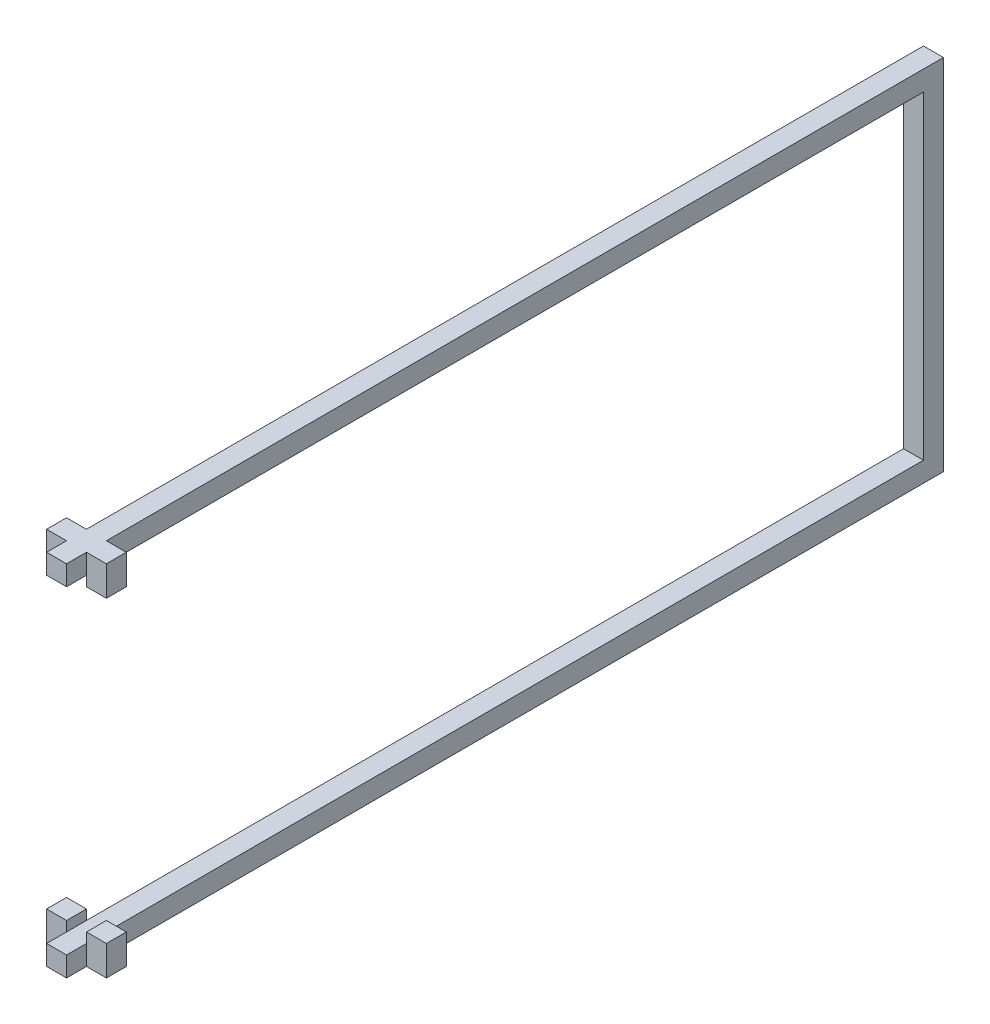
ISO-10303-21;
HEADER;
FILE_DESCRIPTION(('STEP AP214'),'2;1');
FILE_NAME('part.step','',(''),(''),'','','');
FILE_SCHEMA(('AUTOMOTIVE_DESIGN { 1 0 10303 214 1 1 1 1 }'));
ENDSEC;
DATA;
#1=APPLICATION_CONTEXT('core data for automotive mechanical design processes');
#2=APPLICATION_PROTOCOL_DEFINITION('international standard','automotive_design',2000,#1);
#3=PRODUCT_CONTEXT('',#1,'mechanical');
#4=PRODUCT('Part','Part','',(#3));
#5=PRODUCT_RELATED_PRODUCT_CATEGORY('part','',(#4));
#6=PRODUCT_DEFINITION_FORMATION('','',#4);
#7=PRODUCT_DEFINITION_CONTEXT('part definition',#1,'design');
#8=PRODUCT_DEFINITION('design','',#6,#7);
#9=PRODUCT_DEFINITION_SHAPE('','',#8);
#10=(LENGTH_UNIT() NAMED_UNIT(*) SI_UNIT(.MILLI.,.METRE.));
#11=(NAMED_UNIT(*) PLANE_ANGLE_UNIT() SI_UNIT($,.RADIAN.));
#12=(NAMED_UNIT(*) SI_UNIT($,.STERADIAN.) SOLID_ANGLE_UNIT());
#13=UNCERTAINTY_MEASURE_WITH_UNIT(LENGTH_MEASURE(1.E-05),#10,'distance_accuracy_value','');
#14=(GEOMETRIC_REPRESENTATION_CONTEXT(3) GLOBAL_UNCERTAINTY_ASSIGNED_CONTEXT((#13)) GLOBAL_UNIT_ASSIGNED_CONTEXT((#10,
#11,#12)) REPRESENTATION_CONTEXT('',''));
#15=CARTESIAN_POINT('',(0.,0.,0.));
#16=DIRECTION('',(0.,0.,1.));
#17=DIRECTION('',(1.,0.,0.));
#18=AXIS2_PLACEMENT_3D('',#15,#16,#17);
#19=CARTESIAN_POINT('',(0.,0.,111.76));
#20=DIRECTION('',(-1.,0.,0.));
#21=DIRECTION('',(0.,-1.,0.));
#22=AXIS2_PLACEMENT_3D('',#19,#20,#21);
#23=PLANE('',#22);
#24=DIRECTION('',(0.,0.,-1.));
#25=VECTOR('',#24,1.);
#26=CARTESIAN_POINT('',(0.,-43.18,115.352102448428));
#27=LINE('',#26,#25);
#28=CARTESIAN_POINT('',(0.,-43.18,111.76));
#29=VERTEX_POINT('',#28);
#30=CARTESIAN_POINT('',(0.,-43.18,109.22));
#31=VERTEX_POINT('',#30);
#32=EDGE_CURVE('E455',#29,#31,#27,.T.);
#33=ORIENTED_EDGE('',*,*,#32,.T.);
#34=DIRECTION('',(0.,1.,0.));
#35=VECTOR('',#34,1.);
#36=CARTESIAN_POINT('',(0.,-40.64,109.22));
#37=LINE('',#36,#35);
#38=CARTESIAN_POINT('',(0.,-40.64,109.22));
#39=VERTEX_POINT('',#38);
#40=EDGE_CURVE('E63',#31,#39,#37,.T.);
#41=ORIENTED_EDGE('',*,*,#40,.T.);
#42=DIRECTION('',(0.,0.,-1.));
#43=VECTOR('',#42,1.);
#44=CARTESIAN_POINT('',(0.,-40.64,115.352102448428));
#45=LINE('',#44,#43);
#46=CARTESIAN_POINT('',(0.,-40.64,111.76));
#47=VERTEX_POINT('',#46);
#48=EDGE_CURVE('E461',#47,#39,#45,.T.);
#49=ORIENTED_EDGE('',*,*,#48,.F.);
#50=DIRECTION('',(0.,-1.,0.));
#51=VECTOR('',#50,1.);
#52=CARTESIAN_POINT('',(0.,-40.64,111.76));
#53=LINE('',#52,#51);
#54=EDGE_CURVE('E456',#47,#29,#53,.T.);
#55=ORIENTED_EDGE('',*,*,#54,.T.);
#56=EDGE_LOOP('',(#33,#41,#49,#55));
#57=FACE_BOUND('',#56,.T.);
#58=ADVANCED_FACE('F39',(#57),#23,.F.);
#59=CARTESIAN_POINT('',(-2.54,0.,111.76));
#60=DIRECTION('',(1.,0.,0.));
#61=DIRECTION('',(0.,0.,-1.));
#62=AXIS2_PLACEMENT_3D('',#59,#60,#61);
#63=PLANE('',#62);
#64=DIRECTION('',(0.,1.,0.));
#65=VECTOR('',#64,1.);
#66=CARTESIAN_POINT('',(-2.54,-43.18,109.22));
#67=LINE('',#66,#65);
#68=CARTESIAN_POINT('',(-2.54,-43.18,109.22));
#69=VERTEX_POINT('',#68);
#70=CARTESIAN_POINT('',(-2.54,-40.64,109.22));
#71=VERTEX_POINT('',#70);
#72=EDGE_CURVE('E312',#69,#71,#67,.T.);
#73=ORIENTED_EDGE('',*,*,#72,.F.);
#74=DIRECTION('',(0.,0.,-1.));
#75=VECTOR('',#74,1.);
#76=CARTESIAN_POINT('',(-2.54,-43.18,115.352102448428));
#77=LINE('',#76,#75);
#78=CARTESIAN_POINT('',(-2.54,-43.18,111.76));
#79=VERTEX_POINT('',#78);
#80=EDGE_CURVE('E449',#79,#69,#77,.T.);
#81=ORIENTED_EDGE('',*,*,#80,.F.);
#82=DIRECTION('',(0.,1.,0.));
#83=VECTOR('',#82,1.);
#84=CARTESIAN_POINT('',(-2.54,-40.64,111.76));
#85=LINE('',#84,#83);
#86=CARTESIAN_POINT('',(-2.54,-40.64,111.76));
#87=VERTEX_POINT('',#86);
#88=EDGE_CURVE('E444',#79,#87,#85,.T.);
#89=ORIENTED_EDGE('',*,*,#88,.T.);
#90=DIRECTION('',(0.,0.,-1.));
#91=VECTOR('',#90,1.);
#92=CARTESIAN_POINT('',(-2.54,-40.64,115.352102448428));
#93=LINE('',#92,#91);
#94=EDGE_CURVE('E469',#87,#71,#93,.T.);
#95=ORIENTED_EDGE('',*,*,#94,.T.);
#96=EDGE_LOOP('',(#73,#81,#89,#95));
#97=FACE_BOUND('',#96,.T.);
#98=ADVANCED_FACE('F582',(#97),#63,.F.);
#99=CARTESIAN_POINT('',(0.,0.,111.76));
#100=DIRECTION('',(0.,1.,0.));
#101=DIRECTION('',(0.,0.,1.));
#102=AXIS2_PLACEMENT_3D('',#99,#100,#101);
#103=PLANE('',#102);
#104=DIRECTION('',(0.,0.,-1.));
#105=VECTOR('',#104,1.);
#106=CARTESIAN_POINT('',(0.,0.,106.68));
#107=LINE('',#106,#105);
#108=CARTESIAN_POINT('',(0.,0.,109.22));
#109=VERTEX_POINT('',#108);
#110=CARTESIAN_POINT('',(0.,0.,106.68));
#111=VERTEX_POINT('',#110);
#112=EDGE_CURVE('E335',#109,#111,#107,.T.);
#113=ORIENTED_EDGE('',*,*,#112,.F.);
#114=DIRECTION('',(0.,0.,-1.));
#115=VECTOR('',#114,1.);
#116=CARTESIAN_POINT('',(0.,0.,111.76));
#117=LINE('',#116,#115);
#118=CARTESIAN_POINT('',(0.,0.,111.76));
#119=VERTEX_POINT('',#118);
#120=EDGE_CURVE('E515',#119,#109,#117,.T.);
#121=ORIENTED_EDGE('',*,*,#120,.F.);
#122=DIRECTION('',(1.,0.,0.));
#123=VECTOR('',#122,1.);
#124=CARTESIAN_POINT('',(0.,0.,111.76));
#125=LINE('',#124,#123);
#126=CARTESIAN_POINT('',(-2.54,0.,111.76));
#127=VERTEX_POINT('',#126);
#128=EDGE_CURVE('E501',#127,#119,#125,.T.);
#129=ORIENTED_EDGE('',*,*,#128,.F.);
#130=DIRECTION('',(0.,0.,-1.));
#131=VECTOR('',#130,1.);
#132=CARTESIAN_POINT('',(-2.54,0.,111.76));
#133=LINE('',#132,#131);
#134=CARTESIAN_POINT('',(-2.54,0.,109.22));
#135=VERTEX_POINT('',#134);
#136=EDGE_CURVE('E520',#127,#135,#133,.T.);
#137=ORIENTED_EDGE('',*,*,#136,.T.);
#138=DIRECTION('',(0.,0.,1.));
#139=VECTOR('',#138,1.);
#140=CARTESIAN_POINT('',(-2.54,0.,109.22));
#141=LINE('',#140,#139);
#142=CARTESIAN_POINT('',(-2.54,0.,106.68));
#143=VERTEX_POINT('',#142);
#144=EDGE_CURVE('E362',#143,#135,#141,.T.);
#145=ORIENTED_EDGE('',*,*,#144,.F.);
#146=CARTESIAN_POINT('',(-2.54,0.,2.54));
#147=VERTEX_POINT('',#146);
#148=EDGE_CURVE('E519',#143,#147,#133,.T.);
#149=ORIENTED_EDGE('',*,*,#148,.T.);
#150=DIRECTION('',(-1.,0.,0.));
#151=VECTOR('',#150,1.);
#152=CARTESIAN_POINT('',(0.,0.,2.54));
#153=LINE('',#152,#151);
#154=CARTESIAN_POINT('',(0.,0.,2.54));
#155=VERTEX_POINT('',#154);
#156=EDGE_CURVE('E473',#155,#147,#153,.T.);
#157=ORIENTED_EDGE('',*,*,#156,.F.);
#158=EDGE_CURVE('E504',#111,#155,#117,.T.);
#159=ORIENTED_EDGE('',*,*,#158,.F.);
#160=EDGE_LOOP('',(#113,#121,#129,#137,#145,#149,#157,#159));
#161=FACE_BOUND('',#160,.T.);
#162=ADVANCED_FACE('F569',(#161),#103,.F.);
#163=DIRECTION('',(0.,-1.,0.));
#164=VECTOR('',#163,1.);
#165=CARTESIAN_POINT('',(0.,0.,109.22));
#166=LINE('',#165,#164);
#167=CARTESIAN_POINT('',(0.,2.54,109.22));
#168=VERTEX_POINT('',#167);
#169=EDGE_CURVE('E388',#168,#109,#166,.T.);
#170=ORIENTED_EDGE('',*,*,#169,.F.);
#171=DIRECTION('',(0.,0.,-1.));
#172=VECTOR('',#171,1.);
#173=CARTESIAN_POINT('',(0.,2.54,111.76));
#174=LINE('',#173,#172);
#175=CARTESIAN_POINT('',(0.,2.54,111.76));
#176=VERTEX_POINT('',#175);
#177=EDGE_CURVE('E11',#176,#168,#174,.T.);
#178=ORIENTED_EDGE('',*,*,#177,.F.);
#179=DIRECTION('',(0.,1.,0.));
#180=VECTOR('',#179,1.);
#181=CARTESIAN_POINT('',(0.,0.,111.76));
#182=LINE('',#181,#180);
#183=EDGE_CURVE('E490',#119,#176,#182,.T.);
#184=ORIENTED_EDGE('',*,*,#183,.F.);
#185=ORIENTED_EDGE('',*,*,#120,.T.);
#186=EDGE_LOOP('',(#170,#178,#184,#185));
#187=FACE_BOUND('',#186,.T.);
#188=ADVANCED_FACE('F41',(#187),#23,.F.);
#189=CARTESIAN_POINT('',(0.,-40.64,106.68));
#190=VERTEX_POINT('',#189);
#191=CARTESIAN_POINT('',(0.,-40.64,2.54));
#192=VERTEX_POINT('',#191);
#193=EDGE_CURVE('E443',#190,#192,#45,.T.);
#194=ORIENTED_EDGE('',*,*,#193,.F.);
#195=DIRECTION('',(0.,-1.,0.));
#196=VECTOR('',#195,1.);
#197=CARTESIAN_POINT('',(0.,-40.64,106.68));
#198=LINE('',#197,#196);
#199=CARTESIAN_POINT('',(0.,-43.18,106.68));
#200=VERTEX_POINT('',#199);
#201=EDGE_CURVE('E291',#190,#200,#198,.T.);
#202=ORIENTED_EDGE('',*,*,#201,.T.);
#203=CARTESIAN_POINT('',(0.,-43.18,0.));
#204=VERTEX_POINT('',#203);
#205=EDGE_CURVE('E460',#200,#204,#27,.T.);
#206=ORIENTED_EDGE('',*,*,#205,.T.);
#207=DIRECTION('',(0.,1.,0.));
#208=VECTOR('',#207,1.);
#209=CARTESIAN_POINT('',(0.,0.,0.));
#210=LINE('',#209,#208);
#211=CARTESIAN_POINT('',(0.,2.54,0.));
#212=VERTEX_POINT('',#211);
#213=EDGE_CURVE('E489',#204,#212,#210,.T.);
#214=ORIENTED_EDGE('',*,*,#213,.T.);
#215=CARTESIAN_POINT('',(0.,2.54,106.68));
#216=VERTEX_POINT('',#215);
#217=EDGE_CURVE('E48',#216,#212,#174,.T.);
#218=ORIENTED_EDGE('',*,*,#217,.F.);
#219=DIRECTION('',(0.,1.,0.));
#220=VECTOR('',#219,1.);
#221=CARTESIAN_POINT('',(0.,0.,106.68));
#222=LINE('',#221,#220);
#223=EDGE_CURVE('E393',#111,#216,#222,.T.);
#224=ORIENTED_EDGE('',*,*,#223,.F.);
#225=ORIENTED_EDGE('',*,*,#158,.T.);
#226=DIRECTION('',(0.,1.,0.));
#227=VECTOR('',#226,1.);
#228=CARTESIAN_POINT('',(0.,-40.64,2.54));
#229=LINE('',#228,#227);
#230=EDGE_CURVE('E485',#192,#155,#229,.T.);
#231=ORIENTED_EDGE('',*,*,#230,.F.);
#232=EDGE_LOOP('',(#194,#202,#206,#214,#218,#224,#225,#231));
#233=FACE_BOUND('',#232,.T.);
#234=ADVANCED_FACE('F562',(#233),#23,.F.);
#235=CARTESIAN_POINT('',(-2.54,-43.18,106.68));
#236=VERTEX_POINT('',#235);
#237=CARTESIAN_POINT('',(-2.54,-43.18,0.));
#238=VERTEX_POINT('',#237);
#239=EDGE_CURVE('E454',#236,#238,#77,.T.);
#240=ORIENTED_EDGE('',*,*,#239,.F.);
#241=DIRECTION('',(0.,1.,0.));
#242=VECTOR('',#241,1.);
#243=CARTESIAN_POINT('',(-2.54,-43.18,106.68));
#244=LINE('',#243,#242);
#245=CARTESIAN_POINT('',(-2.54,-40.64,106.68));
#246=VERTEX_POINT('',#245);
#247=EDGE_CURVE('E317',#236,#246,#244,.T.);
#248=ORIENTED_EDGE('',*,*,#247,.T.);
#249=CARTESIAN_POINT('',(-2.54,-40.64,2.54));
#250=VERTEX_POINT('',#249);
#251=EDGE_CURVE('E448',#246,#250,#93,.T.);
#252=ORIENTED_EDGE('',*,*,#251,.T.);
#253=DIRECTION('',(0.,1.,0.));
#254=VECTOR('',#253,1.);
#255=CARTESIAN_POINT('',(-2.54,-40.64,2.54));
#256=LINE('',#255,#254);
#257=EDGE_CURVE('E478',#250,#147,#256,.T.);
#258=ORIENTED_EDGE('',*,*,#257,.T.);
#259=ORIENTED_EDGE('',*,*,#148,.F.);
#260=DIRECTION('',(0.,-1.,0.));
#261=VECTOR('',#260,1.);
#262=CARTESIAN_POINT('',(-2.54,2.54,106.68));
#263=LINE('',#262,#261);
#264=CARTESIAN_POINT('',(-2.54,2.54,106.68));
#265=VERTEX_POINT('',#264);
#266=EDGE_CURVE('E413',#265,#143,#263,.T.);
#267=ORIENTED_EDGE('',*,*,#266,.F.);
#268=DIRECTION('',(0.,0.,-1.));
#269=VECTOR('',#268,1.);
#270=CARTESIAN_POINT('',(-2.54,2.54,111.76));
#271=LINE('',#270,#269);
#272=CARTESIAN_POINT('',(-2.54,2.54,0.));
#273=VERTEX_POINT('',#272);
#274=EDGE_CURVE('E523',#265,#273,#271,.T.);
#275=ORIENTED_EDGE('',*,*,#274,.T.);
#276=DIRECTION('',(0.,-1.,0.));
#277=VECTOR('',#276,1.);
#278=CARTESIAN_POINT('',(-2.54,0.,0.));
#279=LINE('',#278,#277);
#280=EDGE_CURVE('E495',#273,#238,#279,.T.);
#281=ORIENTED_EDGE('',*,*,#280,.T.);
#282=EDGE_LOOP('',(#240,#248,#252,#258,#259,#267,#275,#281));
#283=FACE_BOUND('',#282,.T.);
#284=ADVANCED_FACE('F536',(#283),#63,.F.);
#285=CARTESIAN_POINT('',(0.,2.54,111.76));
#286=DIRECTION('',(0.,-1.,0.));
#287=DIRECTION('',(1.,0.,0.));
#288=AXIS2_PLACEMENT_3D('',#285,#286,#287);
#289=PLANE('',#288);
#290=DIRECTION('',(-1.,0.,0.));
#291=VECTOR('',#290,1.);
#292=CARTESIAN_POINT('',(0.,2.54,0.));
#293=LINE('',#292,#291);
#294=EDGE_CURVE('E508',#212,#273,#293,.T.);
#295=ORIENTED_EDGE('',*,*,#294,.T.);
#296=ORIENTED_EDGE('',*,*,#274,.F.);
#297=DIRECTION('',(1.,0.,0.));
#298=VECTOR('',#297,1.);
#299=CARTESIAN_POINT('',(-5.08,2.54,106.68));
#300=LINE('',#299,#298);
#301=CARTESIAN_POINT('',(-5.08,2.54,106.68));
#302=VERTEX_POINT('',#301);
#303=EDGE_CURVE('E424',#302,#265,#300,.T.);
#304=ORIENTED_EDGE('',*,*,#303,.F.);
#305=DIRECTION('',(0.,0.,-1.));
#306=VECTOR('',#305,1.);
#307=CARTESIAN_POINT('',(-5.08,2.54,109.22));
#308=LINE('',#307,#306);
#309=CARTESIAN_POINT('',(-5.08,2.54,109.22));
#310=VERTEX_POINT('',#309);
#311=EDGE_CURVE('E417',#310,#302,#308,.T.);
#312=ORIENTED_EDGE('',*,*,#311,.F.);
#313=DIRECTION('',(1.,0.,0.));
#314=VECTOR('',#313,1.);
#315=CARTESIAN_POINT('',(-5.08,2.54,109.22));
#316=LINE('',#315,#314);
#317=CARTESIAN_POINT('',(-2.54,2.54,109.22));
#318=VERTEX_POINT('',#317);
#319=EDGE_CURVE('E430',#310,#318,#316,.T.);
#320=ORIENTED_EDGE('',*,*,#319,.T.);
#321=CARTESIAN_POINT('',(-2.54,2.54,111.76));
#322=VERTEX_POINT('',#321);
#323=EDGE_CURVE('E524',#322,#318,#271,.T.);
#324=ORIENTED_EDGE('',*,*,#323,.F.);
#325=DIRECTION('',(-1.,0.,0.));
#326=VECTOR('',#325,1.);
#327=CARTESIAN_POINT('',(0.,2.54,111.76));
#328=LINE('',#327,#326);
#329=EDGE_CURVE('E494',#176,#322,#328,.T.);
#330=ORIENTED_EDGE('',*,*,#329,.F.);
#331=ORIENTED_EDGE('',*,*,#177,.T.);
#332=DIRECTION('',(-1.,0.,0.));
#333=VECTOR('',#332,1.);
#334=CARTESIAN_POINT('',(2.54,2.54,109.22));
#335=LINE('',#334,#333);
#336=CARTESIAN_POINT('',(2.54,2.54,109.22));
#337=VERTEX_POINT('',#336);
#338=EDGE_CURVE('E399',#337,#168,#335,.T.);
#339=ORIENTED_EDGE('',*,*,#338,.F.);
#340=DIRECTION('',(0.,0.,1.));
#341=VECTOR('',#340,1.);
#342=CARTESIAN_POINT('',(2.54,2.54,109.22));
#343=LINE('',#342,#341);
#344=CARTESIAN_POINT('',(2.54,2.54,106.68));
#345=VERTEX_POINT('',#344);
#346=EDGE_CURVE('E396',#345,#337,#343,.T.);
#347=ORIENTED_EDGE('',*,*,#346,.F.);
#348=DIRECTION('',(-1.,0.,0.));
#349=VECTOR('',#348,1.);
#350=CARTESIAN_POINT('',(2.54,2.54,106.68));
#351=LINE('',#350,#349);
#352=EDGE_CURVE('E409',#345,#216,#351,.T.);
#353=ORIENTED_EDGE('',*,*,#352,.T.);
#354=ORIENTED_EDGE('',*,*,#217,.T.);
#355=EDGE_LOOP('',(#295,#296,#304,#312,#320,#324,#330,#331,#339,#347,#353,#354));
#356=FACE_BOUND('',#355,.T.);
#357=ADVANCED_FACE('F542',(#356),#289,.F.);
#358=ORIENTED_EDGE('',*,*,#323,.T.);
#359=DIRECTION('',(0.,-1.,0.));
#360=VECTOR('',#359,1.);
#361=CARTESIAN_POINT('',(-2.54,2.54,109.22));
#362=LINE('',#361,#360);
#363=EDGE_CURVE('E418',#318,#135,#362,.T.);
#364=ORIENTED_EDGE('',*,*,#363,.T.);
#365=ORIENTED_EDGE('',*,*,#136,.F.);
#366=DIRECTION('',(0.,-1.,0.));
#367=VECTOR('',#366,1.);
#368=CARTESIAN_POINT('',(-2.54,0.,111.76));
#369=LINE('',#368,#367);
#370=EDGE_CURVE('E498',#322,#127,#369,.T.);
#371=ORIENTED_EDGE('',*,*,#370,.F.);
#372=EDGE_LOOP('',(#358,#364,#365,#371));
#373=FACE_BOUND('',#372,.T.);
#374=ADVANCED_FACE('F631',(#373),#63,.F.);
#375=CARTESIAN_POINT('',(0.,0.,111.76));
#376=DIRECTION('',(0.,0.,1.));
#377=DIRECTION('',(1.,0.,0.));
#378=AXIS2_PLACEMENT_3D('',#375,#376,#377);
#379=PLANE('',#378);
#380=ORIENTED_EDGE('',*,*,#183,.T.);
#381=ORIENTED_EDGE('',*,*,#329,.T.);
#382=ORIENTED_EDGE('',*,*,#370,.T.);
#383=ORIENTED_EDGE('',*,*,#128,.T.);
#384=EDGE_LOOP('',(#380,#381,#382,#383));
#385=FACE_BOUND('',#384,.T.);
#386=ADVANCED_FACE('F644',(#385),#379,.T.);
#387=CARTESIAN_POINT('',(0.,0.,0.));
#388=DIRECTION('',(0.,0.,1.));
#389=DIRECTION('',(1.,0.,0.));
#390=AXIS2_PLACEMENT_3D('',#387,#388,#389);
#391=PLANE('',#390);
#392=ORIENTED_EDGE('',*,*,#213,.F.);
#393=DIRECTION('',(-1.,0.,0.));
#394=VECTOR('',#393,1.);
#395=CARTESIAN_POINT('',(-2.54,-43.18,0.));
#396=LINE('',#395,#394);
#397=EDGE_CURVE('E433',#204,#238,#396,.T.);
#398=ORIENTED_EDGE('',*,*,#397,.T.);
#399=ORIENTED_EDGE('',*,*,#280,.F.);
#400=ORIENTED_EDGE('',*,*,#294,.F.);
#401=EDGE_LOOP('',(#392,#398,#399,#400));
#402=FACE_BOUND('',#401,.T.);
#403=ADVANCED_FACE('F545',(#402),#391,.F.);
#404=CARTESIAN_POINT('',(0.,-40.64,2.54));
#405=DIRECTION('',(0.,0.,-1.));
#406=DIRECTION('',(-1.,0.,0.));
#407=AXIS2_PLACEMENT_3D('',#404,#405,#406);
#408=PLANE('',#407);
#409=ORIENTED_EDGE('',*,*,#156,.T.);
#410=ORIENTED_EDGE('',*,*,#257,.F.);
#411=DIRECTION('',(-1.,0.,0.));
#412=VECTOR('',#411,1.);
#413=CARTESIAN_POINT('',(0.,-40.64,2.54));
#414=LINE('',#413,#412);
#415=EDGE_CURVE('E474',#192,#250,#414,.T.);
#416=ORIENTED_EDGE('',*,*,#415,.F.);
#417=ORIENTED_EDGE('',*,*,#230,.T.);
#418=EDGE_LOOP('',(#409,#410,#416,#417));
#419=FACE_BOUND('',#418,.T.);
#420=ADVANCED_FACE('F561',(#419),#408,.F.);
#421=CARTESIAN_POINT('',(0.,0.,111.76));
#422=DIRECTION('',(0.,0.,1.));
#423=DIRECTION('',(1.,0.,0.));
#424=AXIS2_PLACEMENT_3D('',#421,#422,#423);
#425=PLANE('',#424);
#426=ORIENTED_EDGE('',*,*,#88,.F.);
#427=DIRECTION('',(-1.,0.,0.));
#428=VECTOR('',#427,1.);
#429=CARTESIAN_POINT('',(-2.54,-43.18,111.76));
#430=LINE('',#429,#428);
#431=EDGE_CURVE('E450',#29,#79,#430,.T.);
#432=ORIENTED_EDGE('',*,*,#431,.F.);
#433=ORIENTED_EDGE('',*,*,#54,.F.);
#434=DIRECTION('',(1.,0.,0.));
#435=VECTOR('',#434,1.);
#436=CARTESIAN_POINT('',(-2.54,-40.64,111.76));
#437=LINE('',#436,#435);
#438=EDGE_CURVE('E439',#87,#47,#437,.T.);
#439=ORIENTED_EDGE('',*,*,#438,.F.);
#440=EDGE_LOOP('',(#426,#432,#433,#439));
#441=FACE_BOUND('',#440,.T.);
#442=ADVANCED_FACE('F584',(#441),#425,.T.);
#443=CARTESIAN_POINT('',(-2.54,-40.64,115.352102448428));
#444=DIRECTION('',(0.,1.,0.));
#445=DIRECTION('',(0.,0.,1.));
#446=AXIS2_PLACEMENT_3D('',#443,#444,#445);
#447=PLANE('',#446);
#448=DIRECTION('',(0.,0.,-1.));
#449=VECTOR('',#448,1.);
#450=CARTESIAN_POINT('',(0.,-40.64,106.68));
#451=LINE('',#450,#449);
#452=EDGE_CURVE('E55',#39,#190,#451,.T.);
#453=ORIENTED_EDGE('',*,*,#452,.T.);
#454=ORIENTED_EDGE('',*,*,#193,.T.);
#455=ORIENTED_EDGE('',*,*,#415,.T.);
#456=ORIENTED_EDGE('',*,*,#251,.F.);
#457=DIRECTION('',(0.,0.,1.));
#458=VECTOR('',#457,1.);
#459=CARTESIAN_POINT('',(-2.54,-40.64,109.22));
#460=LINE('',#459,#458);
#461=EDGE_CURVE('E235',#246,#71,#460,.T.);
#462=ORIENTED_EDGE('',*,*,#461,.T.);
#463=ORIENTED_EDGE('',*,*,#94,.F.);
#464=ORIENTED_EDGE('',*,*,#438,.T.);
#465=ORIENTED_EDGE('',*,*,#48,.T.);
#466=EDGE_LOOP('',(#453,#454,#455,#456,#462,#463,#464,#465));
#467=FACE_BOUND('',#466,.T.);
#468=ADVANCED_FACE('F554',(#467),#447,.T.);
#469=CARTESIAN_POINT('',(-2.54,-43.18,115.352102448428));
#470=DIRECTION('',(0.,-1.,0.));
#471=DIRECTION('',(0.,0.,-1.));
#472=AXIS2_PLACEMENT_3D('',#469,#470,#471);
#473=PLANE('',#472);
#474=ORIENTED_EDGE('',*,*,#32,.F.);
#475=ORIENTED_EDGE('',*,*,#431,.T.);
#476=ORIENTED_EDGE('',*,*,#80,.T.);
#477=DIRECTION('',(1.,0.,0.));
#478=VECTOR('',#477,1.);
#479=CARTESIAN_POINT('',(-5.08,-43.18,109.22));
#480=LINE('',#479,#478);
#481=CARTESIAN_POINT('',(-5.08,-43.18,109.22));
#482=VERTEX_POINT('',#481);
#483=EDGE_CURVE('E324',#482,#69,#480,.T.);
#484=ORIENTED_EDGE('',*,*,#483,.F.);
#485=DIRECTION('',(0.,0.,-1.));
#486=VECTOR('',#485,1.);
#487=CARTESIAN_POINT('',(-5.08,-43.18,109.22));
#488=LINE('',#487,#486);
#489=CARTESIAN_POINT('',(-5.08,-43.18,106.68));
#490=VERTEX_POINT('',#489);
#491=EDGE_CURVE('E316',#482,#490,#488,.T.);
#492=ORIENTED_EDGE('',*,*,#491,.T.);
#493=DIRECTION('',(1.,0.,0.));
#494=VECTOR('',#493,1.);
#495=CARTESIAN_POINT('',(-5.08,-43.18,106.68));
#496=LINE('',#495,#494);
#497=EDGE_CURVE('E331',#490,#236,#496,.T.);
#498=ORIENTED_EDGE('',*,*,#497,.T.);
#499=ORIENTED_EDGE('',*,*,#239,.T.);
#500=ORIENTED_EDGE('',*,*,#397,.F.);
#501=ORIENTED_EDGE('',*,*,#205,.F.);
#502=DIRECTION('',(-1.,0.,0.));
#503=VECTOR('',#502,1.);
#504=CARTESIAN_POINT('',(2.54,-43.18,106.68));
#505=LINE('',#504,#503);
#506=CARTESIAN_POINT('',(2.54,-43.18,106.68));
#507=VERTEX_POINT('',#506);
#508=EDGE_CURVE('E299',#507,#200,#505,.T.);
#509=ORIENTED_EDGE('',*,*,#508,.F.);
#510=DIRECTION('',(0.,0.,1.));
#511=VECTOR('',#510,1.);
#512=CARTESIAN_POINT('',(2.54,-43.18,109.22));
#513=LINE('',#512,#511);
#514=CARTESIAN_POINT('',(2.54,-43.18,109.22));
#515=VERTEX_POINT('',#514);
#516=EDGE_CURVE('E290',#507,#515,#513,.T.);
#517=ORIENTED_EDGE('',*,*,#516,.T.);
#518=DIRECTION('',(-1.,0.,0.));
#519=VECTOR('',#518,1.);
#520=CARTESIAN_POINT('',(2.54,-43.18,109.22));
#521=LINE('',#520,#519);
#522=EDGE_CURVE('E308',#515,#31,#521,.T.);
#523=ORIENTED_EDGE('',*,*,#522,.T.);
#524=EDGE_LOOP('',(#474,#475,#476,#484,#492,#498,#499,#500,#501,#509,#517,#523));
#525=FACE_BOUND('',#524,.T.);
#526=ADVANCED_FACE('F549',(#525),#473,.T.);
#527=CARTESIAN_POINT('',(-5.08,2.54,109.22));
#528=DIRECTION('',(0.,0.,1.));
#529=DIRECTION('',(1.,0.,0.));
#530=AXIS2_PLACEMENT_3D('',#527,#528,#529);
#531=PLANE('',#530);
#532=ORIENTED_EDGE('',*,*,#363,.F.);
#533=ORIENTED_EDGE('',*,*,#319,.F.);
#534=DIRECTION('',(0.,-1.,0.));
#535=VECTOR('',#534,1.);
#536=CARTESIAN_POINT('',(-5.08,2.54,109.22));
#537=LINE('',#536,#535);
#538=CARTESIAN_POINT('',(-5.08,-1.27,109.22));
#539=VERTEX_POINT('',#538);
#540=EDGE_CURVE('E421',#310,#539,#537,.T.);
#541=ORIENTED_EDGE('',*,*,#540,.T.);
#542=DIRECTION('',(-1.,0.,0.));
#543=VECTOR('',#542,1.);
#544=CARTESIAN_POINT('',(-5.08,-1.27,109.22));
#545=LINE('',#544,#543);
#546=CARTESIAN_POINT('',(-2.54,-1.27,109.22));
#547=VERTEX_POINT('',#546);
#548=EDGE_CURVE('E373',#547,#539,#545,.T.);
#549=ORIENTED_EDGE('',*,*,#548,.F.);
#550=DIRECTION('',(0.,1.,0.));
#551=VECTOR('',#550,1.);
#552=CARTESIAN_POINT('',(-2.54,-1.27,109.22));
#553=LINE('',#552,#551);
#554=EDGE_CURVE('E377',#547,#135,#553,.T.);
#555=ORIENTED_EDGE('',*,*,#554,.T.);
#556=EDGE_LOOP('',(#532,#533,#541,#549,#555));
#557=FACE_BOUND('',#556,.T.);
#558=ADVANCED_FACE('F671',(#557),#531,.T.);
#559=CARTESIAN_POINT('',(-5.08,2.54,106.68));
#560=DIRECTION('',(0.,0.,1.));
#561=DIRECTION('',(1.,0.,0.));
#562=AXIS2_PLACEMENT_3D('',#559,#560,#561);
#563=PLANE('',#562);
#564=ORIENTED_EDGE('',*,*,#266,.T.);
#565=DIRECTION('',(0.,1.,0.));
#566=VECTOR('',#565,1.);
#567=CARTESIAN_POINT('',(-2.54,-1.27,106.68));
#568=LINE('',#567,#566);
#569=CARTESIAN_POINT('',(-2.54,-1.27,106.68));
#570=VERTEX_POINT('',#569);
#571=EDGE_CURVE('E384',#570,#143,#568,.T.);
#572=ORIENTED_EDGE('',*,*,#571,.F.);
#573=DIRECTION('',(1.,0.,0.));
#574=VECTOR('',#573,1.);
#575=CARTESIAN_POINT('',(-5.08,-1.27,106.68));
#576=LINE('',#575,#574);
#577=CARTESIAN_POINT('',(-5.08,-1.27,106.68));
#578=VERTEX_POINT('',#577);
#579=EDGE_CURVE('E367',#578,#570,#576,.T.);
#580=ORIENTED_EDGE('',*,*,#579,.F.);
#581=DIRECTION('',(0.,-1.,0.));
#582=VECTOR('',#581,1.);
#583=CARTESIAN_POINT('',(-5.08,2.54,106.68));
#584=LINE('',#583,#582);
#585=EDGE_CURVE('E414',#302,#578,#584,.T.);
#586=ORIENTED_EDGE('',*,*,#585,.F.);
#587=ORIENTED_EDGE('',*,*,#303,.T.);
#588=EDGE_LOOP('',(#564,#572,#580,#586,#587));
#589=FACE_BOUND('',#588,.T.);
#590=ADVANCED_FACE('F622',(#589),#563,.F.);
#591=CARTESIAN_POINT('',(-5.08,0.,0.));
#592=DIRECTION('',(-1.,0.,0.));
#593=DIRECTION('',(0.,0.,1.));
#594=AXIS2_PLACEMENT_3D('',#591,#592,#593);
#595=PLANE('',#594);
#596=ORIENTED_EDGE('',*,*,#585,.T.);
#597=DIRECTION('',(0.,0.,-1.));
#598=VECTOR('',#597,1.);
#599=CARTESIAN_POINT('',(-5.08,-1.27,109.22));
#600=LINE('',#599,#598);
#601=EDGE_CURVE('E363',#539,#578,#600,.T.);
#602=ORIENTED_EDGE('',*,*,#601,.F.);
#603=ORIENTED_EDGE('',*,*,#540,.F.);
#604=ORIENTED_EDGE('',*,*,#311,.T.);
#605=EDGE_LOOP('',(#596,#602,#603,#604));
#606=FACE_BOUND('',#605,.T.);
#607=ADVANCED_FACE('F615',(#606),#595,.T.);
#608=CARTESIAN_POINT('',(2.54,0.,109.22));
#609=DIRECTION('',(0.,0.,-1.));
#610=DIRECTION('',(-1.,0.,0.));
#611=AXIS2_PLACEMENT_3D('',#608,#609,#610);
#612=PLANE('',#611);
#613=ORIENTED_EDGE('',*,*,#169,.T.);
#614=DIRECTION('',(0.,1.,0.));
#615=VECTOR('',#614,1.);
#616=CARTESIAN_POINT('',(0.,-1.27,109.22));
#617=LINE('',#616,#615);
#618=CARTESIAN_POINT('',(0.,-1.27,109.22));
#619=VERTEX_POINT('',#618);
#620=EDGE_CURVE('E353',#619,#109,#617,.T.);
#621=ORIENTED_EDGE('',*,*,#620,.F.);
#622=DIRECTION('',(-1.,0.,0.));
#623=VECTOR('',#622,1.);
#624=CARTESIAN_POINT('',(0.,-1.27,109.22));
#625=LINE('',#624,#623);
#626=CARTESIAN_POINT('',(2.54,-1.27,109.22));
#627=VERTEX_POINT('',#626);
#628=EDGE_CURVE('E350',#627,#619,#625,.T.);
#629=ORIENTED_EDGE('',*,*,#628,.F.);
#630=DIRECTION('',(0.,-1.,0.));
#631=VECTOR('',#630,1.);
#632=CARTESIAN_POINT('',(2.54,0.,109.22));
#633=LINE('',#632,#631);
#634=EDGE_CURVE('E389',#337,#627,#633,.T.);
#635=ORIENTED_EDGE('',*,*,#634,.F.);
#636=ORIENTED_EDGE('',*,*,#338,.T.);
#637=EDGE_LOOP('',(#613,#621,#629,#635,#636));
#638=FACE_BOUND('',#637,.T.);
#639=ADVANCED_FACE('F613',(#638),#612,.F.);
#640=CARTESIAN_POINT('',(2.54,0.,106.68));
#641=DIRECTION('',(0.,0.,1.));
#642=DIRECTION('',(1.,0.,0.));
#643=AXIS2_PLACEMENT_3D('',#640,#641,#642);
#644=PLANE('',#643);
#645=ORIENTED_EDGE('',*,*,#223,.T.);
#646=ORIENTED_EDGE('',*,*,#352,.F.);
#647=DIRECTION('',(0.,1.,0.));
#648=VECTOR('',#647,1.);
#649=CARTESIAN_POINT('',(2.54,0.,106.68));
#650=LINE('',#649,#648);
#651=CARTESIAN_POINT('',(2.54,-1.27,106.68));
#652=VERTEX_POINT('',#651);
#653=EDGE_CURVE('E392',#652,#345,#650,.T.);
#654=ORIENTED_EDGE('',*,*,#653,.F.);
#655=DIRECTION('',(1.,0.,0.));
#656=VECTOR('',#655,1.);
#657=CARTESIAN_POINT('',(0.,-1.27,106.68));
#658=LINE('',#657,#656);
#659=CARTESIAN_POINT('',(0.,-1.27,106.68));
#660=VERTEX_POINT('',#659);
#661=EDGE_CURVE('E342',#660,#652,#658,.T.);
#662=ORIENTED_EDGE('',*,*,#661,.F.);
#663=DIRECTION('',(0.,1.,0.));
#664=VECTOR('',#663,1.);
#665=CARTESIAN_POINT('',(0.,-1.27,106.68));
#666=LINE('',#665,#664);
#667=EDGE_CURVE('E359',#660,#111,#666,.T.);
#668=ORIENTED_EDGE('',*,*,#667,.T.);
#669=EDGE_LOOP('',(#645,#646,#654,#662,#668));
#670=FACE_BOUND('',#669,.T.);
#671=ADVANCED_FACE('F592',(#670),#644,.F.);
#672=CARTESIAN_POINT('',(2.54,0.,0.));
#673=DIRECTION('',(-1.,0.,0.));
#674=DIRECTION('',(0.,-1.,0.));
#675=AXIS2_PLACEMENT_3D('',#672,#673,#674);
#676=PLANE('',#675);
#677=ORIENTED_EDGE('',*,*,#634,.T.);
#678=DIRECTION('',(0.,0.,1.));
#679=VECTOR('',#678,1.);
#680=CARTESIAN_POINT('',(2.54,-1.27,106.68));
#681=LINE('',#680,#679);
#682=EDGE_CURVE('E346',#652,#627,#681,.T.);
#683=ORIENTED_EDGE('',*,*,#682,.F.);
#684=ORIENTED_EDGE('',*,*,#653,.T.);
#685=ORIENTED_EDGE('',*,*,#346,.T.);
#686=EDGE_LOOP('',(#677,#683,#684,#685));
#687=FACE_BOUND('',#686,.T.);
#688=ADVANCED_FACE('F598',(#687),#676,.F.);
#689=CARTESIAN_POINT('',(-2.54,-1.27,109.22));
#690=DIRECTION('',(-1.,0.,0.));
#691=DIRECTION('',(0.,0.,1.));
#692=AXIS2_PLACEMENT_3D('',#689,#690,#691);
#693=PLANE('',#692);
#694=ORIENTED_EDGE('',*,*,#144,.T.);
#695=ORIENTED_EDGE('',*,*,#554,.F.);
#696=DIRECTION('',(0.,0.,1.));
#697=VECTOR('',#696,1.);
#698=CARTESIAN_POINT('',(-2.54,-1.27,109.22));
#699=LINE('',#698,#697);
#700=EDGE_CURVE('E370',#570,#547,#699,.T.);
#701=ORIENTED_EDGE('',*,*,#700,.F.);
#702=ORIENTED_EDGE('',*,*,#571,.T.);
#703=EDGE_LOOP('',(#694,#695,#701,#702));
#704=FACE_BOUND('',#703,.T.);
#705=ADVANCED_FACE('F778',(#704),#693,.F.);
#706=CARTESIAN_POINT('',(0.,-1.27,0.));
#707=DIRECTION('',(0.,-1.,0.));
#708=DIRECTION('',(0.,0.,-1.));
#709=AXIS2_PLACEMENT_3D('',#706,#707,#708);
#710=PLANE('',#709);
#711=ORIENTED_EDGE('',*,*,#601,.T.);
#712=ORIENTED_EDGE('',*,*,#579,.T.);
#713=ORIENTED_EDGE('',*,*,#700,.T.);
#714=ORIENTED_EDGE('',*,*,#548,.T.);
#715=EDGE_LOOP('',(#711,#712,#713,#714));
#716=FACE_BOUND('',#715,.T.);
#717=ADVANCED_FACE('F775',(#716),#710,.T.);
#718=CARTESIAN_POINT('',(0.,-1.27,106.68));
#719=DIRECTION('',(1.,0.,0.));
#720=DIRECTION('',(0.,0.,-1.));
#721=AXIS2_PLACEMENT_3D('',#718,#719,#720);
#722=PLANE('',#721);
#723=ORIENTED_EDGE('',*,*,#112,.T.);
#724=ORIENTED_EDGE('',*,*,#667,.F.);
#725=DIRECTION('',(0.,0.,-1.));
#726=VECTOR('',#725,1.);
#727=CARTESIAN_POINT('',(0.,-1.27,106.68));
#728=LINE('',#727,#726);
#729=EDGE_CURVE('E338',#619,#660,#728,.T.);
#730=ORIENTED_EDGE('',*,*,#729,.F.);
#731=ORIENTED_EDGE('',*,*,#620,.T.);
#732=EDGE_LOOP('',(#723,#724,#730,#731));
#733=FACE_BOUND('',#732,.T.);
#734=ADVANCED_FACE('F606',(#733),#722,.F.);
#735=CARTESIAN_POINT('',(0.,-1.27,0.));
#736=DIRECTION('',(0.,1.,0.));
#737=DIRECTION('',(0.,0.,1.));
#738=AXIS2_PLACEMENT_3D('',#735,#736,#737);
#739=PLANE('',#738);
#740=ORIENTED_EDGE('',*,*,#729,.T.);
#741=ORIENTED_EDGE('',*,*,#661,.T.);
#742=ORIENTED_EDGE('',*,*,#682,.T.);
#743=ORIENTED_EDGE('',*,*,#628,.T.);
#744=EDGE_LOOP('',(#740,#741,#742,#743));
#745=FACE_BOUND('',#744,.T.);
#746=ADVANCED_FACE('F601',(#745),#739,.F.);
#747=CARTESIAN_POINT('',(-5.08,-43.18,106.68));
#748=DIRECTION('',(0.,0.,-1.));
#749=DIRECTION('',(-1.,0.,0.));
#750=AXIS2_PLACEMENT_3D('',#747,#748,#749);
#751=PLANE('',#750);
#752=ORIENTED_EDGE('',*,*,#247,.F.);
#753=ORIENTED_EDGE('',*,*,#497,.F.);
#754=DIRECTION('',(0.,1.,0.));
#755=VECTOR('',#754,1.);
#756=CARTESIAN_POINT('',(-5.08,-43.18,106.68));
#757=LINE('',#756,#755);
#758=CARTESIAN_POINT('',(-5.08,-39.37,106.68));
#759=VERTEX_POINT('',#758);
#760=EDGE_CURVE('E321',#490,#759,#757,.T.);
#761=ORIENTED_EDGE('',*,*,#760,.T.);
#762=DIRECTION('',(1.,0.,0.));
#763=VECTOR('',#762,1.);
#764=CARTESIAN_POINT('',(-5.08,-39.37,106.68));
#765=LINE('',#764,#763);
#766=CARTESIAN_POINT('',(-2.54,-39.37,106.68));
#767=VERTEX_POINT('',#766);
#768=EDGE_CURVE('E275',#759,#767,#765,.T.);
#769=ORIENTED_EDGE('',*,*,#768,.T.);
#770=DIRECTION('',(0.,-1.,0.));
#771=VECTOR('',#770,1.);
#772=CARTESIAN_POINT('',(-2.54,-39.37,106.68));
#773=LINE('',#772,#771);
#774=EDGE_CURVE('E279',#767,#246,#773,.T.);
#775=ORIENTED_EDGE('',*,*,#774,.T.);
#776=EDGE_LOOP('',(#752,#753,#761,#769,#775));
#777=FACE_BOUND('',#776,.T.);
#778=ADVANCED_FACE('F679',(#777),#751,.T.);
#779=CARTESIAN_POINT('',(-5.08,-43.18,109.22));
#780=DIRECTION('',(0.,0.,-1.));
#781=DIRECTION('',(-1.,0.,0.));
#782=AXIS2_PLACEMENT_3D('',#779,#780,#781);
#783=PLANE('',#782);
#784=ORIENTED_EDGE('',*,*,#72,.T.);
#785=DIRECTION('',(0.,-1.,0.));
#786=VECTOR('',#785,1.);
#787=CARTESIAN_POINT('',(-2.54,-39.37,109.22));
#788=LINE('',#787,#786);
#789=CARTESIAN_POINT('',(-2.54,-39.37,109.22));
#790=VERTEX_POINT('',#789);
#791=EDGE_CURVE('E285',#790,#71,#788,.T.);
#792=ORIENTED_EDGE('',*,*,#791,.F.);
#793=DIRECTION('',(-1.,0.,0.));
#794=VECTOR('',#793,1.);
#795=CARTESIAN_POINT('',(-5.08,-39.37,109.22));
#796=LINE('',#795,#794);
#797=CARTESIAN_POINT('',(-5.08,-39.37,109.22));
#798=VERTEX_POINT('',#797);
#799=EDGE_CURVE('E267',#790,#798,#796,.T.);
#800=ORIENTED_EDGE('',*,*,#799,.T.);
#801=DIRECTION('',(0.,1.,0.));
#802=VECTOR('',#801,1.);
#803=CARTESIAN_POINT('',(-5.08,-43.18,109.22));
#804=LINE('',#803,#802);
#805=EDGE_CURVE('E313',#482,#798,#804,.T.);
#806=ORIENTED_EDGE('',*,*,#805,.F.);
#807=ORIENTED_EDGE('',*,*,#483,.T.);
#808=EDGE_LOOP('',(#784,#792,#800,#806,#807));
#809=FACE_BOUND('',#808,.T.);
#810=ADVANCED_FACE('F577',(#809),#783,.F.);
#811=CARTESIAN_POINT('',(-5.08,-40.64,0.));
#812=DIRECTION('',(-1.,0.,0.));
#813=DIRECTION('',(0.,0.,1.));
#814=AXIS2_PLACEMENT_3D('',#811,#812,#813);
#815=PLANE('',#814);
#816=ORIENTED_EDGE('',*,*,#805,.T.);
#817=DIRECTION('',(0.,0.,-1.));
#818=VECTOR('',#817,1.);
#819=CARTESIAN_POINT('',(-5.08,-39.37,109.22));
#820=LINE('',#819,#818);
#821=EDGE_CURVE('E263',#798,#759,#820,.T.);
#822=ORIENTED_EDGE('',*,*,#821,.T.);
#823=ORIENTED_EDGE('',*,*,#760,.F.);
#824=ORIENTED_EDGE('',*,*,#491,.F.);
#825=EDGE_LOOP('',(#816,#822,#823,#824));
#826=FACE_BOUND('',#825,.T.);
#827=ADVANCED_FACE('F696',(#826),#815,.T.);
#828=CARTESIAN_POINT('',(2.54,-40.64,109.22));
#829=DIRECTION('',(0.,0.,1.));
#830=DIRECTION('',(1.,0.,0.));
#831=AXIS2_PLACEMENT_3D('',#828,#829,#830);
#832=PLANE('',#831);
#833=ORIENTED_EDGE('',*,*,#40,.F.);
#834=ORIENTED_EDGE('',*,*,#522,.F.);
#835=DIRECTION('',(0.,1.,0.));
#836=VECTOR('',#835,1.);
#837=CARTESIAN_POINT('',(2.54,-40.64,109.22));
#838=LINE('',#837,#836);
#839=CARTESIAN_POINT('',(2.54,-39.37,109.22));
#840=VERTEX_POINT('',#839);
#841=EDGE_CURVE('E250',#515,#840,#838,.T.);
#842=ORIENTED_EDGE('',*,*,#841,.T.);
#843=DIRECTION('',(-1.,0.,0.));
#844=VECTOR('',#843,1.);
#845=CARTESIAN_POINT('',(0.,-39.37,109.22));
#846=LINE('',#845,#844);
#847=CARTESIAN_POINT('',(0.,-39.37,109.22));
#848=VERTEX_POINT('',#847);
#849=EDGE_CURVE('E242',#840,#848,#846,.T.);
#850=ORIENTED_EDGE('',*,*,#849,.T.);
#851=DIRECTION('',(0.,-1.,0.));
#852=VECTOR('',#851,1.);
#853=CARTESIAN_POINT('',(0.,-39.37,109.22));
#854=LINE('',#853,#852);
#855=EDGE_CURVE('E226',#848,#39,#854,.T.);
#856=ORIENTED_EDGE('',*,*,#855,.T.);
#857=EDGE_LOOP('',(#833,#834,#842,#850,#856));
#858=FACE_BOUND('',#857,.T.);
#859=ADVANCED_FACE('F248',(#858),#832,.T.);
#860=CARTESIAN_POINT('',(2.54,-40.64,106.68));
#861=DIRECTION('',(0.,0.,-1.));
#862=DIRECTION('',(-1.,0.,0.));
#863=AXIS2_PLACEMENT_3D('',#860,#861,#862);
#864=PLANE('',#863);
#865=ORIENTED_EDGE('',*,*,#201,.F.);
#866=DIRECTION('',(0.,-1.,0.));
#867=VECTOR('',#866,1.);
#868=CARTESIAN_POINT('',(0.,-39.37,106.68));
#869=LINE('',#868,#867);
#870=CARTESIAN_POINT('',(0.,-39.37,106.68));
#871=VERTEX_POINT('',#870);
#872=EDGE_CURVE('E236',#871,#190,#869,.T.);
#873=ORIENTED_EDGE('',*,*,#872,.F.);
#874=DIRECTION('',(1.,0.,0.));
#875=VECTOR('',#874,1.);
#876=CARTESIAN_POINT('',(0.,-39.37,106.68));
#877=LINE('',#876,#875);
#878=CARTESIAN_POINT('',(2.54,-39.37,106.68));
#879=VERTEX_POINT('',#878);
#880=EDGE_CURVE('E245',#871,#879,#877,.T.);
#881=ORIENTED_EDGE('',*,*,#880,.T.);
#882=DIRECTION('',(0.,-1.,0.));
#883=VECTOR('',#882,1.);
#884=CARTESIAN_POINT('',(2.54,-40.64,106.68));
#885=LINE('',#884,#883);
#886=EDGE_CURVE('E295',#879,#507,#885,.T.);
#887=ORIENTED_EDGE('',*,*,#886,.T.);
#888=ORIENTED_EDGE('',*,*,#508,.T.);
#889=EDGE_LOOP('',(#865,#873,#881,#887,#888));
#890=FACE_BOUND('',#889,.T.);
#891=ADVANCED_FACE('F589',(#890),#864,.T.);
#892=CARTESIAN_POINT('',(2.54,-40.64,0.));
#893=DIRECTION('',(-1.,0.,0.));
#894=DIRECTION('',(0.,1.,0.));
#895=AXIS2_PLACEMENT_3D('',#892,#893,#894);
#896=PLANE('',#895);
#897=ORIENTED_EDGE('',*,*,#841,.F.);
#898=ORIENTED_EDGE('',*,*,#516,.F.);
#899=ORIENTED_EDGE('',*,*,#886,.F.);
#900=DIRECTION('',(0.,0.,1.));
#901=VECTOR('',#900,1.);
#902=CARTESIAN_POINT('',(2.54,-39.37,106.68));
#903=LINE('',#902,#901);
#904=EDGE_CURVE('E252',#879,#840,#903,.T.);
#905=ORIENTED_EDGE('',*,*,#904,.T.);
#906=EDGE_LOOP('',(#897,#898,#899,#905));
#907=FACE_BOUND('',#906,.T.);
#908=ADVANCED_FACE('F587',(#907),#896,.F.);
#909=CARTESIAN_POINT('',(-2.54,-39.37,109.22));
#910=DIRECTION('',(1.,0.,0.));
#911=DIRECTION('',(0.,0.,-1.));
#912=AXIS2_PLACEMENT_3D('',#909,#910,#911);
#913=PLANE('',#912);
#914=ORIENTED_EDGE('',*,*,#461,.F.);
#915=ORIENTED_EDGE('',*,*,#774,.F.);
#916=DIRECTION('',(0.,0.,1.));
#917=VECTOR('',#916,1.);
#918=CARTESIAN_POINT('',(-2.54,-39.37,109.22));
#919=LINE('',#918,#917);
#920=EDGE_CURVE('E271',#767,#790,#919,.T.);
#921=ORIENTED_EDGE('',*,*,#920,.T.);
#922=ORIENTED_EDGE('',*,*,#791,.T.);
#923=EDGE_LOOP('',(#914,#915,#921,#922));
#924=FACE_BOUND('',#923,.T.);
#925=ADVANCED_FACE('F733',(#924),#913,.T.);
#926=CARTESIAN_POINT('',(0.,-39.37,0.));
#927=DIRECTION('',(0.,1.,0.));
#928=DIRECTION('',(0.,0.,-1.));
#929=AXIS2_PLACEMENT_3D('',#926,#927,#928);
#930=PLANE('',#929);
#931=ORIENTED_EDGE('',*,*,#821,.F.);
#932=ORIENTED_EDGE('',*,*,#799,.F.);
#933=ORIENTED_EDGE('',*,*,#920,.F.);
#934=ORIENTED_EDGE('',*,*,#768,.F.);
#935=EDGE_LOOP('',(#931,#932,#933,#934));
#936=FACE_BOUND('',#935,.T.);
#937=ADVANCED_FACE('F742',(#936),#930,.T.);
#938=CARTESIAN_POINT('',(0.,-39.37,106.68));
#939=DIRECTION('',(-1.,0.,0.));
#940=DIRECTION('',(0.,0.,1.));
#941=AXIS2_PLACEMENT_3D('',#938,#939,#940);
#942=PLANE('',#941);
#943=ORIENTED_EDGE('',*,*,#452,.F.);
#944=ORIENTED_EDGE('',*,*,#855,.F.);
#945=DIRECTION('',(0.,0.,-1.));
#946=VECTOR('',#945,1.);
#947=CARTESIAN_POINT('',(0.,-39.37,106.68));
#948=LINE('',#947,#946);
#949=EDGE_CURVE('E230',#848,#871,#948,.T.);
#950=ORIENTED_EDGE('',*,*,#949,.T.);
#951=ORIENTED_EDGE('',*,*,#872,.T.);
#952=EDGE_LOOP('',(#943,#944,#950,#951));
#953=FACE_BOUND('',#952,.T.);
#954=ADVANCED_FACE('F228',(#953),#942,.T.);
#955=CARTESIAN_POINT('',(0.,-39.37,0.));
#956=DIRECTION('',(0.,-1.,0.));
#957=DIRECTION('',(0.,0.,1.));
#958=AXIS2_PLACEMENT_3D('',#955,#956,#957);
#959=PLANE('',#958);
#960=ORIENTED_EDGE('',*,*,#949,.F.);
#961=ORIENTED_EDGE('',*,*,#849,.F.);
#962=ORIENTED_EDGE('',*,*,#904,.F.);
#963=ORIENTED_EDGE('',*,*,#880,.F.);
#964=EDGE_LOOP('',(#960,#961,#962,#963));
#965=FACE_BOUND('',#964,.T.);
#966=ADVANCED_FACE('F240',(#965),#959,.F.);
#967=CLOSED_SHELL('',(#58,#98,#162,#188,#234,#284,#357,#374,#386,#403,#420,#442,#468,#526,#558,
#590,#607,#639,#671,#688,#705,#717,#734,#746,#778,#810,#827,#859,#891,#908,#925,#937,#954,#966));
#968=MANIFOLD_SOLID_BREP('B2',#967);
#969=ADVANCED_BREP_SHAPE_REPRESENTATION('',(#18,#968),#14);
#970=SHAPE_DEFINITION_REPRESENTATION(#9,#969);
ENDSEC;
END-ISO-10303-21;
